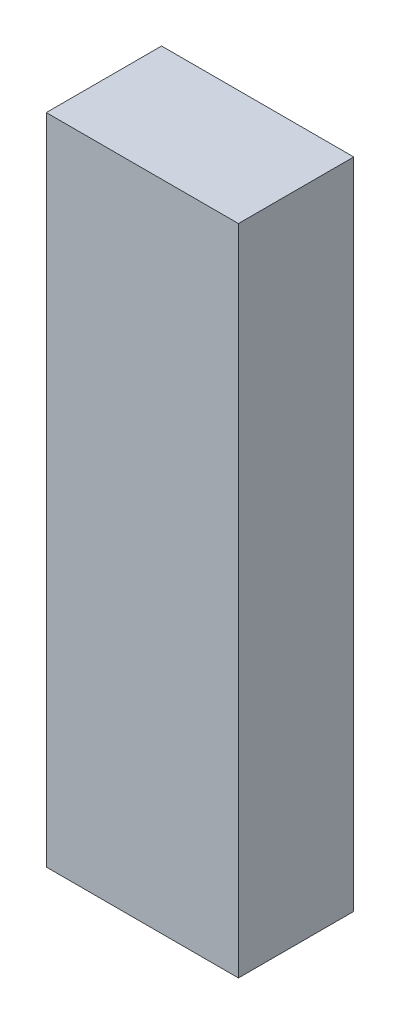
ISO-10303-21;
HEADER;
FILE_DESCRIPTION(('STEP AP214'),'2;1');
FILE_NAME('part.step','',(''),(''),'','','');
FILE_SCHEMA(('AUTOMOTIVE_DESIGN { 1 0 10303 214 1 1 1 1 }'));
ENDSEC;
DATA;
#1=APPLICATION_CONTEXT('core data for automotive mechanical design processes');
#2=APPLICATION_PROTOCOL_DEFINITION('international standard','automotive_design',2000,#1);
#3=PRODUCT_CONTEXT('',#1,'mechanical');
#4=PRODUCT('Part','Part','',(#3));
#5=PRODUCT_RELATED_PRODUCT_CATEGORY('part','',(#4));
#6=PRODUCT_DEFINITION_FORMATION('','',#4);
#7=PRODUCT_DEFINITION_CONTEXT('part definition',#1,'design');
#8=PRODUCT_DEFINITION('design','',#6,#7);
#9=PRODUCT_DEFINITION_SHAPE('','',#8);
#10=(LENGTH_UNIT() NAMED_UNIT(*) SI_UNIT(.MILLI.,.METRE.));
#11=(NAMED_UNIT(*) PLANE_ANGLE_UNIT() SI_UNIT($,.RADIAN.));
#12=(NAMED_UNIT(*) SI_UNIT($,.STERADIAN.) SOLID_ANGLE_UNIT());
#13=UNCERTAINTY_MEASURE_WITH_UNIT(LENGTH_MEASURE(1.E-05),#10,'distance_accuracy_value','');
#14=(GEOMETRIC_REPRESENTATION_CONTEXT(3) GLOBAL_UNCERTAINTY_ASSIGNED_CONTEXT((#13)) GLOBAL_UNIT_ASSIGNED_CONTEXT((#10,
#11,#12)) REPRESENTATION_CONTEXT('',''));
#15=CARTESIAN_POINT('',(0.,0.,0.));
#16=DIRECTION('',(0.,0.,1.));
#17=DIRECTION('',(1.,0.,0.));
#18=AXIS2_PLACEMENT_3D('',#15,#16,#17);
#19=CARTESIAN_POINT('',(17.4949987036093,21.9529999999915,-5.03699996995919));
#20=DIRECTION('',(0.,-1.,0.));
#21=DIRECTION('',(0.,0.,-1.));
#22=AXIS2_PLACEMENT_3D('',#19,#20,#21);
#23=PLANE('',#22);
#24=DIRECTION('',(0.,0.,1.));
#25=VECTOR('',#24,1.);
#26=CARTESIAN_POINT('',(12.4949987036093,21.9529999999915,-5.03699996995921));
#27=LINE('',#26,#25);
#28=CARTESIAN_POINT('',(12.4949987036093,21.9529999999915,-8.037));
#29=VERTEX_POINT('',#28);
#30=CARTESIAN_POINT('',(12.4949987036093,21.9529999999915,-2.0369999399184));
#31=VERTEX_POINT('',#30);
#32=EDGE_CURVE('E65',#29,#31,#27,.T.);
#33=ORIENTED_EDGE('',*,*,#32,.T.);
#34=DIRECTION('',(-1.,0.,0.));
#35=VECTOR('',#34,1.);
#36=CARTESIAN_POINT('',(17.4949987036093,21.9529999999915,-2.03699993991838));
#37=LINE('',#36,#35);
#38=CARTESIAN_POINT('',(22.4949987036093,21.9529999999915,-2.03699993991837));
#39=VERTEX_POINT('',#38);
#40=EDGE_CURVE('E68',#39,#31,#37,.T.);
#41=ORIENTED_EDGE('',*,*,#40,.F.);
#42=DIRECTION('',(0.,0.,1.));
#43=VECTOR('',#42,1.);
#44=CARTESIAN_POINT('',(22.4949987036093,21.9529999999915,-5.03699996995918));
#45=LINE('',#44,#43);
#46=CARTESIAN_POINT('',(22.4949987036093,21.9529999999915,-8.037));
#47=VERTEX_POINT('',#46);
#48=EDGE_CURVE('E11',#47,#39,#45,.T.);
#49=ORIENTED_EDGE('',*,*,#48,.F.);
#50=DIRECTION('',(1.,0.,0.));
#51=VECTOR('',#50,1.);
#52=CARTESIAN_POINT('',(17.4949987036093,21.9529999999915,-8.037));
#53=LINE('',#52,#51);
#54=EDGE_CURVE('E71',#29,#47,#53,.T.);
#55=ORIENTED_EDGE('',*,*,#54,.F.);
#56=EDGE_LOOP('',(#33,#41,#49,#55));
#57=FACE_BOUND('',#56,.T.);
#58=ADVANCED_FACE('F17',(#57),#23,.F.);
#59=CARTESIAN_POINT('',(22.4949987036093,4.95299999999155,-5.03699996995918));
#60=DIRECTION('',(-1.,0.,0.));
#61=DIRECTION('',(0.,0.,1.));
#62=AXIS2_PLACEMENT_3D('',#59,#60,#61);
#63=PLANE('',#62);
#64=ORIENTED_EDGE('',*,*,#48,.T.);
#65=DIRECTION('',(0.,1.,0.));
#66=VECTOR('',#65,1.);
#67=CARTESIAN_POINT('',(22.4949987036093,4.95299999999155,-2.03699993991837));
#68=LINE('',#67,#66);
#69=CARTESIAN_POINT('',(22.4949987036093,-12.0470000000085,-2.03699993991837));
#70=VERTEX_POINT('',#69);
#71=EDGE_CURVE('E87',#70,#39,#68,.T.);
#72=ORIENTED_EDGE('',*,*,#71,.F.);
#73=DIRECTION('',(0.,0.,1.));
#74=VECTOR('',#73,1.);
#75=CARTESIAN_POINT('',(22.4949987036093,-12.0470000000085,-5.03699996995918));
#76=LINE('',#75,#74);
#77=CARTESIAN_POINT('',(22.4949987036093,-12.0470000000085,-8.037));
#78=VERTEX_POINT('',#77);
#79=EDGE_CURVE('E26',#78,#70,#76,.T.);
#80=ORIENTED_EDGE('',*,*,#79,.F.);
#81=DIRECTION('',(0.,-1.,0.));
#82=VECTOR('',#81,1.);
#83=CARTESIAN_POINT('',(22.4949987036093,4.95299999999155,-8.037));
#84=LINE('',#83,#82);
#85=EDGE_CURVE('E135',#47,#78,#84,.T.);
#86=ORIENTED_EDGE('',*,*,#85,.F.);
#87=EDGE_LOOP('',(#64,#72,#80,#86));
#88=FACE_BOUND('',#87,.T.);
#89=ADVANCED_FACE('F163',(#88),#63,.F.);
#90=CARTESIAN_POINT('',(17.4949987036093,-12.0470000000085,-5.03699996995919));
#91=DIRECTION('',(0.,1.,0.));
#92=DIRECTION('',(1.,0.,0.));
#93=AXIS2_PLACEMENT_3D('',#90,#91,#92);
#94=PLANE('',#93);
#95=ORIENTED_EDGE('',*,*,#79,.T.);
#96=DIRECTION('',(1.,0.,0.));
#97=VECTOR('',#96,1.);
#98=CARTESIAN_POINT('',(17.4949987036093,-12.0470000000085,-2.03699993991838));
#99=LINE('',#98,#97);
#100=CARTESIAN_POINT('',(12.4949987036093,-12.0470000000085,-2.0369999399184));
#101=VERTEX_POINT('',#100);
#102=EDGE_CURVE('E84',#101,#70,#99,.T.);
#103=ORIENTED_EDGE('',*,*,#102,.F.);
#104=DIRECTION('',(0.,0.,1.));
#105=VECTOR('',#104,1.);
#106=CARTESIAN_POINT('',(12.4949987036093,-12.0470000000085,-5.03699996995921));
#107=LINE('',#106,#105);
#108=CARTESIAN_POINT('',(12.4949987036093,-12.0470000000085,-8.037));
#109=VERTEX_POINT('',#108);
#110=EDGE_CURVE('E76',#109,#101,#107,.T.);
#111=ORIENTED_EDGE('',*,*,#110,.F.);
#112=DIRECTION('',(-1.,0.,0.));
#113=VECTOR('',#112,1.);
#114=CARTESIAN_POINT('',(17.4949987036093,-12.0470000000085,-8.037));
#115=LINE('',#114,#113);
#116=EDGE_CURVE('E95',#78,#109,#115,.T.);
#117=ORIENTED_EDGE('',*,*,#116,.F.);
#118=EDGE_LOOP('',(#95,#103,#111,#117));
#119=FACE_BOUND('',#118,.T.);
#120=ADVANCED_FACE('F170',(#119),#94,.F.);
#121=CARTESIAN_POINT('',(12.4949987036093,4.95299999999155,-5.03699996995921));
#122=DIRECTION('',(1.,0.,0.));
#123=DIRECTION('',(0.,0.,1.));
#124=AXIS2_PLACEMENT_3D('',#121,#122,#123);
#125=PLANE('',#124);
#126=ORIENTED_EDGE('',*,*,#110,.T.);
#127=DIRECTION('',(0.,-1.,0.));
#128=VECTOR('',#127,1.);
#129=CARTESIAN_POINT('',(12.4949987036093,4.95299999999155,-2.0369999399184));
#130=LINE('',#129,#128);
#131=EDGE_CURVE('E79',#31,#101,#130,.T.);
#132=ORIENTED_EDGE('',*,*,#131,.F.);
#133=ORIENTED_EDGE('',*,*,#32,.F.);
#134=DIRECTION('',(0.,1.,0.));
#135=VECTOR('',#134,1.);
#136=CARTESIAN_POINT('',(12.4949987036093,4.95299999999155,-8.037));
#137=LINE('',#136,#135);
#138=EDGE_CURVE('E89',#109,#29,#137,.T.);
#139=ORIENTED_EDGE('',*,*,#138,.F.);
#140=EDGE_LOOP('',(#126,#132,#133,#139));
#141=FACE_BOUND('',#140,.T.);
#142=ADVANCED_FACE('F80',(#141),#125,.F.);
#143=CARTESIAN_POINT('',(17.4949987036093,4.95299999999155,-2.03699993991838));
#144=DIRECTION('',(0.,0.,-1.));
#145=DIRECTION('',(0.,-1.,0.));
#146=AXIS2_PLACEMENT_3D('',#143,#144,#145);
#147=PLANE('',#146);
#148=ORIENTED_EDGE('',*,*,#40,.T.);
#149=ORIENTED_EDGE('',*,*,#131,.T.);
#150=ORIENTED_EDGE('',*,*,#102,.T.);
#151=ORIENTED_EDGE('',*,*,#71,.T.);
#152=EDGE_LOOP('',(#148,#149,#150,#151));
#153=FACE_BOUND('',#152,.T.);
#154=ADVANCED_FACE('F86',(#153),#147,.F.);
#155=CARTESIAN_POINT('',(17.4949987036093,4.95299999999155,-8.037));
#156=DIRECTION('',(0.,0.,-1.));
#157=DIRECTION('',(0.,-1.,0.));
#158=AXIS2_PLACEMENT_3D('',#155,#156,#157);
#159=PLANE('',#158);
#160=ORIENTED_EDGE('',*,*,#54,.T.);
#161=ORIENTED_EDGE('',*,*,#85,.T.);
#162=ORIENTED_EDGE('',*,*,#116,.T.);
#163=ORIENTED_EDGE('',*,*,#138,.T.);
#164=EDGE_LOOP('',(#160,#161,#162,#163));
#165=FACE_BOUND('',#164,.T.);
#166=ADVANCED_FACE('F151',(#165),#159,.T.);
#167=CLOSED_SHELL('',(#58,#89,#120,#142,#154,#166));
#168=MANIFOLD_SOLID_BREP('B1',#167);
#169=ADVANCED_BREP_SHAPE_REPRESENTATION('',(#18,#168),#14);
#170=SHAPE_DEFINITION_REPRESENTATION(#9,#169);
ENDSEC;
END-ISO-10303-21;
